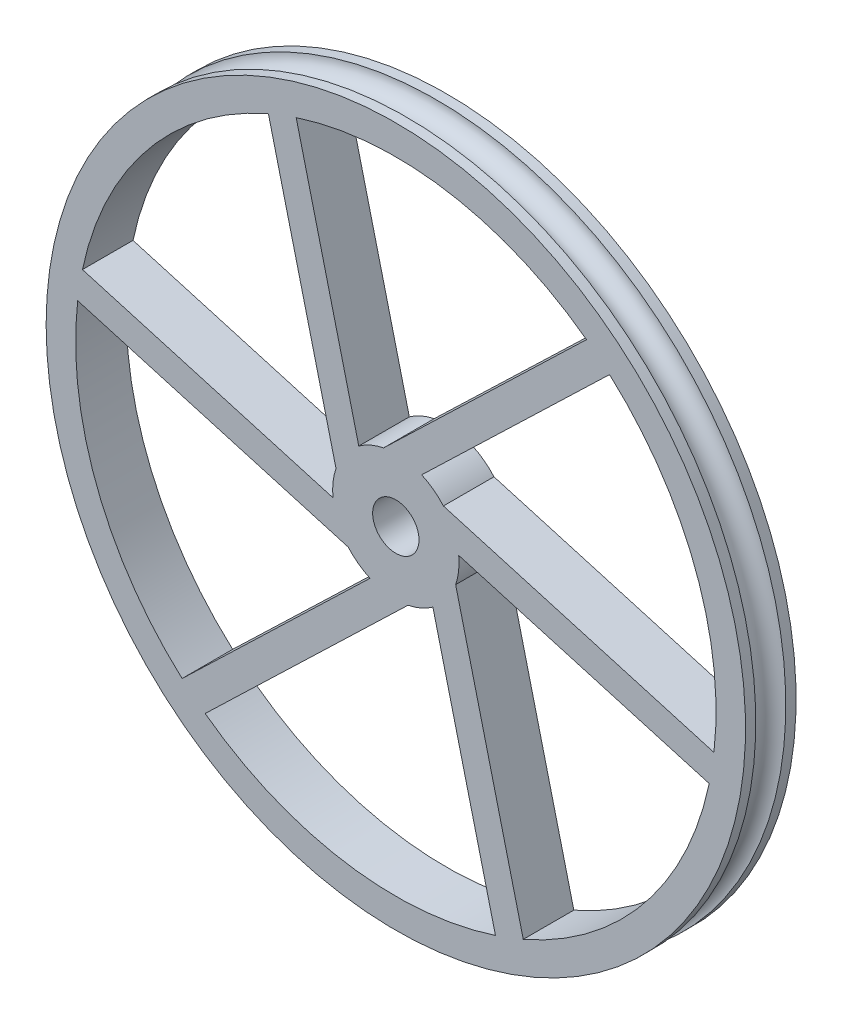
ISO-10303-21;
HEADER;
FILE_DESCRIPTION(('STEP AP214'),'2;1');
FILE_NAME('part.step','',(''),(''),'','','');
FILE_SCHEMA(('AUTOMOTIVE_DESIGN { 1 0 10303 214 1 1 1 1 }'));
ENDSEC;
DATA;
#1=APPLICATION_CONTEXT('core data for automotive mechanical design processes');
#2=APPLICATION_PROTOCOL_DEFINITION('international standard','automotive_design',2000,#1);
#3=PRODUCT_CONTEXT('',#1,'mechanical');
#4=PRODUCT('Part','Part','',(#3));
#5=PRODUCT_RELATED_PRODUCT_CATEGORY('part','',(#4));
#6=PRODUCT_DEFINITION_FORMATION('','',#4);
#7=PRODUCT_DEFINITION_CONTEXT('part definition',#1,'design');
#8=PRODUCT_DEFINITION('design','',#6,#7);
#9=PRODUCT_DEFINITION_SHAPE('','',#8);
#10=(LENGTH_UNIT() NAMED_UNIT(*) SI_UNIT(.MILLI.,.METRE.));
#11=(NAMED_UNIT(*) PLANE_ANGLE_UNIT() SI_UNIT($,.RADIAN.));
#12=(NAMED_UNIT(*) SI_UNIT($,.STERADIAN.) SOLID_ANGLE_UNIT());
#13=UNCERTAINTY_MEASURE_WITH_UNIT(LENGTH_MEASURE(1.E-05),#10,'distance_accuracy_value','');
#14=(GEOMETRIC_REPRESENTATION_CONTEXT(3) GLOBAL_UNCERTAINTY_ASSIGNED_CONTEXT((#13)) GLOBAL_UNIT_ASSIGNED_CONTEXT((#10,
#11,#12)) REPRESENTATION_CONTEXT('',''));
#15=CARTESIAN_POINT('',(0.,0.,0.));
#16=DIRECTION('',(0.,0.,1.));
#17=DIRECTION('',(1.,0.,0.));
#18=AXIS2_PLACEMENT_3D('',#15,#16,#17);
#19=CARTESIAN_POINT('',(0.,0.,-19.9253514058086));
#20=DIRECTION('',(0.,0.,-1.));
#21=DIRECTION('',(-1.,0.,0.));
#22=AXIS2_PLACEMENT_3D('',#19,#20,#21);
#23=CYLINDRICAL_SURFACE('',#22,38.);
#24=CARTESIAN_POINT('',(0.,0.,-3.));
#25=DIRECTION('',(0.,0.,-1.));
#26=DIRECTION('',(-1.,0.,0.));
#27=AXIS2_PLACEMENT_3D('',#24,#25,#26);
#28=CIRCLE('',#27,38.);
#29=CARTESIAN_POINT('',(-37.1875077373794,7.81596240282339,-3.));
#30=VERTEX_POINT('',#29);
#31=CARTESIAN_POINT('',(-15.1209287709684,34.8619780434688,-3.));
#32=VERTEX_POINT('',#31);
#33=EDGE_CURVE('E425',#30,#32,#28,.T.);
#34=ORIENTED_EDGE('',*,*,#33,.T.);
#35=DIRECTION('',(0.,0.,-1.));
#36=VECTOR('',#35,1.);
#37=CARTESIAN_POINT('',(-15.1209287709684,34.8619780434688,-19.9253514058086));
#38=LINE('',#37,#36);
#39=CARTESIAN_POINT('',(-15.1209287709684,34.8619780434688,3.));
#40=VERTEX_POINT('',#39);
#41=EDGE_CURVE('E58',#32,#40,#38,.F.);
#42=ORIENTED_EDGE('',*,*,#41,.T.);
#43=CARTESIAN_POINT('',(0.,0.,3.));
#44=DIRECTION('',(0.,0.,-1.));
#45=DIRECTION('',(-1.,0.,0.));
#46=AXIS2_PLACEMENT_3D('',#43,#44,#45);
#47=CIRCLE('',#46,38.);
#48=CARTESIAN_POINT('',(-37.1875077373794,7.81596240282339,3.));
#49=VERTEX_POINT('',#48);
#50=EDGE_CURVE('E387',#49,#40,#47,.T.);
#51=ORIENTED_EDGE('',*,*,#50,.F.);
#52=DIRECTION('',(0.,0.,-1.));
#53=VECTOR('',#52,1.);
#54=CARTESIAN_POINT('',(-37.1875077373794,7.81596240282339,-19.9253514058086));
#55=LINE('',#54,#53);
#56=EDGE_CURVE('E287',#49,#30,#55,.T.);
#57=ORIENTED_EDGE('',*,*,#56,.T.);
#58=EDGE_LOOP('',(#34,#42,#51,#57));
#59=FACE_BOUND('',#58,.T.);
#60=ADVANCED_FACE('F35',(#59),#23,.F.);
#61=CARTESIAN_POINT('',(0.,0.,24.2132034355964));
#62=DIRECTION('',(0.,0.,-1.));
#63=DIRECTION('',(-1.,0.,0.));
#64=AXIS2_PLACEMENT_3D('',#61,#62,#63);
#65=CYLINDRICAL_SURFACE('',#64,7.5);
#66=CARTESIAN_POINT('',(0.,0.,3.));
#67=DIRECTION('',(0.,0.,-1.));
#68=DIRECTION('',(-1.,0.,0.));
#69=AXIS2_PLACEMENT_3D('',#66,#67,#68);
#70=CIRCLE('',#69,7.5);
#71=CARTESIAN_POINT('',(-7.46029961760869,-0.770668291489712,3.));
#72=VERTEX_POINT('',#71);
#73=CARTESIAN_POINT('',(-7.09899238602963,2.41956754464373,3.));
#74=VERTEX_POINT('',#73);
#75=EDGE_CURVE('E222',#72,#74,#70,.T.);
#76=ORIENTED_EDGE('',*,*,#75,.T.);
#77=DIRECTION('',(0.,0.,1.));
#78=VECTOR('',#77,1.);
#79=CARTESIAN_POINT('',(-7.09899238602963,2.41956754464373,-39.1272046270146));
#80=LINE('',#79,#78);
#81=CARTESIAN_POINT('',(-7.09899238602963,2.41956754464373,-3.));
#82=VERTEX_POINT('',#81);
#83=EDGE_CURVE('E215',#82,#74,#80,.T.);
#84=ORIENTED_EDGE('',*,*,#83,.F.);
#85=CARTESIAN_POINT('',(0.,0.,-3.));
#86=DIRECTION('',(0.,0.,1.));
#87=DIRECTION('',(1.,0.,0.));
#88=AXIS2_PLACEMENT_3D('',#85,#86,#87);
#89=CIRCLE('',#88,7.5);
#90=CARTESIAN_POINT('',(-7.46029961760869,-0.770668291489713,-3.));
#91=VERTEX_POINT('',#90);
#92=EDGE_CURVE('E353',#91,#82,#89,.F.);
#93=ORIENTED_EDGE('',*,*,#92,.F.);
#94=DIRECTION('',(0.,0.,1.));
#95=VECTOR('',#94,1.);
#96=CARTESIAN_POINT('',(-7.46029961760869,-0.770668291489712,-39.1272046270146));
#97=LINE('',#96,#95);
#98=EDGE_CURVE('E272',#91,#72,#97,.T.);
#99=ORIENTED_EDGE('',*,*,#98,.T.);
#100=EDGE_LOOP('',(#76,#84,#93,#99));
#101=FACE_BOUND('',#100,.T.);
#102=ADVANCED_FACE('F452',(#101),#65,.T.);
#103=CARTESIAN_POINT('',(-25.3625758645587,-28.2973452025893,-3.));
#104=VERTEX_POINT('',#103);
#105=CARTESIAN_POINT('',(-37.7518229973035,4.33588057726065,-3.));
#106=VERTEX_POINT('',#105);
#107=EDGE_CURVE('E426',#104,#106,#28,.T.);
#108=ORIENTED_EDGE('',*,*,#107,.T.);
#109=DIRECTION('',(0.,0.,-1.));
#110=VECTOR('',#109,1.);
#111=CARTESIAN_POINT('',(-37.7518229973035,4.33588057726065,-19.9253514058086));
#112=LINE('',#111,#110);
#113=CARTESIAN_POINT('',(-37.7518229973035,4.33588057726065,3.));
#114=VERTEX_POINT('',#113);
#115=EDGE_CURVE('E290',#106,#114,#112,.F.);
#116=ORIENTED_EDGE('',*,*,#115,.T.);
#117=CARTESIAN_POINT('',(-25.3625758645587,-28.2973452025893,3.));
#118=VERTEX_POINT('',#117);
#119=EDGE_CURVE('E269',#118,#114,#47,.T.);
#120=ORIENTED_EDGE('',*,*,#119,.F.);
#121=DIRECTION('',(0.,0.,-1.));
#122=VECTOR('',#121,1.);
#123=CARTESIAN_POINT('',(-25.3625758645587,-28.2973452025893,-19.9253514058086));
#124=LINE('',#123,#122);
#125=EDGE_CURVE('E305',#118,#104,#124,.T.);
#126=ORIENTED_EDGE('',*,*,#125,.T.);
#127=EDGE_LOOP('',(#108,#116,#120,#126));
#128=FACE_BOUND('',#127,.T.);
#129=ADVANCED_FACE('F453',(#128),#23,.F.);
#130=CARTESIAN_POINT('',(-3.06273149048309,-6.84614313443728,3.));
#131=VERTEX_POINT('',#130);
#132=CARTESIAN_POINT('',(-5.64490315284863,-4.9381239752521,3.));
#133=VERTEX_POINT('',#132);
#134=EDGE_CURVE('E227',#131,#133,#70,.T.);
#135=ORIENTED_EDGE('',*,*,#134,.T.);
#136=DIRECTION('',(0.,0.,1.));
#137=VECTOR('',#136,1.);
#138=CARTESIAN_POINT('',(-5.64490315284863,-4.9381239752521,-39.1272046270146));
#139=LINE('',#138,#137);
#140=CARTESIAN_POINT('',(-5.64490315284863,-4.9381239752521,-3.));
#141=VERTEX_POINT('',#140);
#142=EDGE_CURVE('E259',#141,#133,#139,.T.);
#143=ORIENTED_EDGE('',*,*,#142,.F.);
#144=CARTESIAN_POINT('',(-3.06273149048312,-6.84614313443731,-3.));
#145=VERTEX_POINT('',#144);
#146=EDGE_CURVE('E357',#145,#141,#89,.F.);
#147=ORIENTED_EDGE('',*,*,#146,.F.);
#148=DIRECTION('',(0.,0.,1.));
#149=VECTOR('',#148,1.);
#150=CARTESIAN_POINT('',(-3.06273149048309,-6.84614313443728,-39.1272046270146));
#151=LINE('',#150,#149);
#152=EDGE_CURVE('E261',#145,#131,#151,.T.);
#153=ORIENTED_EDGE('',*,*,#152,.T.);
#154=EDGE_LOOP('',(#135,#143,#147,#153));
#155=FACE_BOUND('',#154,.T.);
#156=ADVANCED_FACE('F256',(#155),#65,.T.);
#157=CARTESIAN_POINT('',(11.8249318728208,-36.1133076054125,-3.));
#158=VERTEX_POINT('',#157);
#159=CARTESIAN_POINT('',(-22.6308942263349,-30.5260974662082,-3.));
#160=VERTEX_POINT('',#159);
#161=EDGE_CURVE('E427',#158,#160,#28,.T.);
#162=ORIENTED_EDGE('',*,*,#161,.T.);
#163=DIRECTION('',(0.,0.,-1.));
#164=VECTOR('',#163,1.);
#165=CARTESIAN_POINT('',(-22.6308942263349,-30.5260974662082,-19.9253514058086));
#166=LINE('',#165,#164);
#167=CARTESIAN_POINT('',(-22.6308942263349,-30.5260974662082,3.));
#168=VERTEX_POINT('',#167);
#169=EDGE_CURVE('E308',#160,#168,#166,.F.);
#170=ORIENTED_EDGE('',*,*,#169,.T.);
#171=CARTESIAN_POINT('',(11.8249318728208,-36.1133076054125,3.));
#172=VERTEX_POINT('',#171);
#173=EDGE_CURVE('E384',#172,#168,#47,.T.);
#174=ORIENTED_EDGE('',*,*,#173,.F.);
#175=DIRECTION('',(0.,0.,-1.));
#176=VECTOR('',#175,1.);
#177=CARTESIAN_POINT('',(11.8249318728208,-36.1133076054125,-19.9253514058086));
#178=LINE('',#177,#176);
#179=EDGE_CURVE('E326',#172,#158,#178,.T.);
#180=ORIENTED_EDGE('',*,*,#179,.T.);
#181=EDGE_LOOP('',(#162,#170,#174,#180));
#182=FACE_BOUND('',#181,.T.);
#183=ADVANCED_FACE('F431',(#182),#23,.F.);
#184=CARTESIAN_POINT('',(4.39756812712559,-6.07547484294757,3.));
#185=VERTEX_POINT('',#184);
#186=CARTESIAN_POINT('',(1.45408923318101,-7.3576915198958,3.));
#187=VERTEX_POINT('',#186);
#188=EDGE_CURVE('E241',#185,#187,#70,.T.);
#189=ORIENTED_EDGE('',*,*,#188,.T.);
#190=DIRECTION('',(0.,0.,1.));
#191=VECTOR('',#190,1.);
#192=CARTESIAN_POINT('',(1.45408923318101,-7.3576915198958,-39.1272046270146));
#193=LINE('',#192,#191);
#194=CARTESIAN_POINT('',(1.45408923318101,-7.3576915198958,-3.));
#195=VERTEX_POINT('',#194);
#196=EDGE_CURVE('E296',#195,#187,#193,.T.);
#197=ORIENTED_EDGE('',*,*,#196,.F.);
#198=CARTESIAN_POINT('',(4.3975681271256,-6.07547484294759,-3.));
#199=VERTEX_POINT('',#198);
#200=EDGE_CURVE('E361',#199,#195,#89,.F.);
#201=ORIENTED_EDGE('',*,*,#200,.F.);
#202=DIRECTION('',(0.,0.,1.));
#203=VECTOR('',#202,1.);
#204=CARTESIAN_POINT('',(4.39756812712559,-6.07547484294757,-39.1272046270146));
#205=LINE('',#204,#203);
#206=EDGE_CURVE('E320',#199,#185,#205,.T.);
#207=ORIENTED_EDGE('',*,*,#206,.T.);
#208=EDGE_LOOP('',(#189,#197,#201,#207));
#209=FACE_BOUND('',#208,.T.);
#210=ADVANCED_FACE('F473',(#209),#65,.T.);
#211=CARTESIAN_POINT('',(37.1875077373794,-7.81596240282326,-3.));
#212=VERTEX_POINT('',#211);
#213=CARTESIAN_POINT('',(15.1209287709687,-34.8619780434686,-3.));
#214=VERTEX_POINT('',#213);
#215=EDGE_CURVE('E381',#212,#214,#28,.T.);
#216=ORIENTED_EDGE('',*,*,#215,.T.);
#217=DIRECTION('',(0.,0.,-1.));
#218=VECTOR('',#217,1.);
#219=CARTESIAN_POINT('',(15.1209287709687,-34.8619780434686,-19.9253514058086));
#220=LINE('',#219,#218);
#221=CARTESIAN_POINT('',(15.1209287709687,-34.8619780434686,3.));
#222=VERTEX_POINT('',#221);
#223=EDGE_CURVE('E329',#214,#222,#220,.F.);
#224=ORIENTED_EDGE('',*,*,#223,.T.);
#225=CARTESIAN_POINT('',(37.1875077373794,-7.81596240282326,3.));
#226=VERTEX_POINT('',#225);
#227=EDGE_CURVE('E43',#226,#222,#47,.T.);
#228=ORIENTED_EDGE('',*,*,#227,.F.);
#229=DIRECTION('',(0.,0.,-1.));
#230=VECTOR('',#229,1.);
#231=CARTESIAN_POINT('',(37.1875077373794,-7.81596240282326,-19.9253514058086));
#232=LINE('',#231,#230);
#233=EDGE_CURVE('E347',#226,#212,#232,.T.);
#234=ORIENTED_EDGE('',*,*,#233,.T.);
#235=EDGE_LOOP('',(#216,#224,#228,#234));
#236=FACE_BOUND('',#235,.T.);
#237=ADVANCED_FACE('F379',(#236),#23,.F.);
#238=CARTESIAN_POINT('',(7.4602996176087,0.770668291489744,3.));
#239=VERTEX_POINT('',#238);
#240=CARTESIAN_POINT('',(7.09899238602964,-2.4195675446437,3.));
#241=VERTEX_POINT('',#240);
#242=EDGE_CURVE('E234',#239,#241,#70,.T.);
#243=ORIENTED_EDGE('',*,*,#242,.T.);
#244=DIRECTION('',(0.,0.,1.));
#245=VECTOR('',#244,1.);
#246=CARTESIAN_POINT('',(7.09899238602964,-2.4195675446437,-39.1272046270146));
#247=LINE('',#246,#245);
#248=CARTESIAN_POINT('',(7.09899238602964,-2.4195675446437,-3.));
#249=VERTEX_POINT('',#248);
#250=EDGE_CURVE('E315',#249,#241,#247,.T.);
#251=ORIENTED_EDGE('',*,*,#250,.F.);
#252=CARTESIAN_POINT('',(7.46029961760868,0.770668291489751,-3.));
#253=VERTEX_POINT('',#252);
#254=EDGE_CURVE('E229',#253,#249,#89,.F.);
#255=ORIENTED_EDGE('',*,*,#254,.F.);
#256=DIRECTION('',(0.,0.,1.));
#257=VECTOR('',#256,1.);
#258=CARTESIAN_POINT('',(7.4602996176087,0.770668291489744,-39.1272046270146));
#259=LINE('',#258,#257);
#260=EDGE_CURVE('E341',#253,#239,#259,.T.);
#261=ORIENTED_EDGE('',*,*,#260,.T.);
#262=EDGE_LOOP('',(#243,#251,#255,#261));
#263=FACE_BOUND('',#262,.T.);
#264=ADVANCED_FACE('F372',(#263),#65,.T.);
#265=CARTESIAN_POINT('',(25.3625758645589,28.2973452025892,-3.));
#266=VERTEX_POINT('',#265);
#267=CARTESIAN_POINT('',(37.7518229973035,-4.33588057726052,-3.));
#268=VERTEX_POINT('',#267);
#269=EDGE_CURVE('E405',#266,#268,#28,.T.);
#270=ORIENTED_EDGE('',*,*,#269,.T.);
#271=DIRECTION('',(0.,0.,-1.));
#272=VECTOR('',#271,1.);
#273=CARTESIAN_POINT('',(37.7518229973035,-4.33588057726051,-19.9253514058086));
#274=LINE('',#273,#272);
#275=CARTESIAN_POINT('',(37.7518229973035,-4.33588057726052,3.));
#276=VERTEX_POINT('',#275);
#277=EDGE_CURVE('E350',#268,#276,#274,.F.);
#278=ORIENTED_EDGE('',*,*,#277,.T.);
#279=CARTESIAN_POINT('',(25.3625758645589,28.2973452025892,3.));
#280=VERTEX_POINT('',#279);
#281=EDGE_CURVE('E11',#280,#276,#47,.T.);
#282=ORIENTED_EDGE('',*,*,#281,.F.);
#283=DIRECTION('',(0.,0.,-1.));
#284=VECTOR('',#283,1.);
#285=CARTESIAN_POINT('',(25.3625758645589,28.2973452025892,-19.9253514058086));
#286=LINE('',#285,#284);
#287=EDGE_CURVE('E410',#280,#266,#286,.T.);
#288=ORIENTED_EDGE('',*,*,#287,.T.);
#289=EDGE_LOOP('',(#270,#278,#282,#288));
#290=FACE_BOUND('',#289,.T.);
#291=ADVANCED_FACE('F462',(#290),#23,.F.);
#292=CARTESIAN_POINT('',(3.0627314904831,6.84614313443731,3.));
#293=VERTEX_POINT('',#292);
#294=CARTESIAN_POINT('',(5.64490315284864,4.93812397525213,3.));
#295=VERTEX_POINT('',#294);
#296=EDGE_CURVE('E225',#293,#295,#70,.T.);
#297=ORIENTED_EDGE('',*,*,#296,.T.);
#298=DIRECTION('',(0.,0.,1.));
#299=VECTOR('',#298,1.);
#300=CARTESIAN_POINT('',(5.64490315284864,4.93812397525213,-39.1272046270146));
#301=LINE('',#300,#299);
#302=CARTESIAN_POINT('',(5.64490315284864,4.93812397525213,-3.));
#303=VERTEX_POINT('',#302);
#304=EDGE_CURVE('E336',#303,#295,#301,.T.);
#305=ORIENTED_EDGE('',*,*,#304,.F.);
#306=CARTESIAN_POINT('',(3.0627314904831,6.84614313443731,-3.));
#307=VERTEX_POINT('',#306);
#308=EDGE_CURVE('E223',#307,#303,#89,.F.);
#309=ORIENTED_EDGE('',*,*,#308,.F.);
#310=DIRECTION('',(0.,0.,1.));
#311=VECTOR('',#310,1.);
#312=CARTESIAN_POINT('',(3.06273149048311,6.84614313443731,-39.1272046270146));
#313=LINE('',#312,#311);
#314=EDGE_CURVE('E417',#307,#293,#313,.T.);
#315=ORIENTED_EDGE('',*,*,#314,.T.);
#316=EDGE_LOOP('',(#297,#305,#309,#315));
#317=FACE_BOUND('',#316,.T.);
#318=ADVANCED_FACE('F461',(#317),#65,.T.);
#319=CARTESIAN_POINT('',(-11.8249318728205,36.1133076054127,3.));
#320=VERTEX_POINT('',#319);
#321=CARTESIAN_POINT('',(22.6308942263351,30.5260974662081,3.));
#322=VERTEX_POINT('',#321);
#323=EDGE_CURVE('E44',#320,#322,#47,.T.);
#324=ORIENTED_EDGE('',*,*,#323,.F.);
#325=DIRECTION('',(0.,0.,-1.));
#326=VECTOR('',#325,1.);
#327=CARTESIAN_POINT('',(-11.8249318728205,36.1133076054127,-19.9253514058086));
#328=LINE('',#327,#326);
#329=CARTESIAN_POINT('',(-11.8249318728205,36.1133076054127,-3.));
#330=VERTEX_POINT('',#329);
#331=EDGE_CURVE('E202',#320,#330,#328,.T.);
#332=ORIENTED_EDGE('',*,*,#331,.T.);
#333=CARTESIAN_POINT('',(22.6308942263351,30.5260974662081,-3.));
#334=VERTEX_POINT('',#333);
#335=EDGE_CURVE('E407',#330,#334,#28,.T.);
#336=ORIENTED_EDGE('',*,*,#335,.T.);
#337=DIRECTION('',(0.,0.,-1.));
#338=VECTOR('',#337,1.);
#339=CARTESIAN_POINT('',(22.6308942263351,30.5260974662081,-19.9253514058086));
#340=LINE('',#339,#338);
#341=EDGE_CURVE('E408',#334,#322,#340,.F.);
#342=ORIENTED_EDGE('',*,*,#341,.T.);
#343=EDGE_LOOP('',(#324,#332,#336,#342));
#344=FACE_BOUND('',#343,.T.);
#345=ADVANCED_FACE('F37',(#344),#23,.F.);
#346=CARTESIAN_POINT('',(38.,0.,3.));
#347=DIRECTION('',(0.,0.,-1.));
#348=DIRECTION('',(-1.,0.,0.));
#349=AXIS2_PLACEMENT_3D('',#346,#347,#348);
#350=PLANE('',#349);
#351=CARTESIAN_POINT('',(0.,0.,3.));
#352=DIRECTION('',(0.,0.,1.));
#353=DIRECTION('',(1.,0.,0.));
#354=AXIS2_PLACEMENT_3D('',#351,#352,#353);
#355=CIRCLE('',#354,2.75);
#356=CARTESIAN_POINT('',(2.75,0.,3.));
#357=VERTEX_POINT('',#356);
#358=EDGE_CURVE('E714',#357,#357,#355,.T.);
#359=ORIENTED_EDGE('',*,*,#358,.F.);
#360=EDGE_LOOP('',(#359));
#361=FACE_BOUND('',#360,.T.);
#362=ORIENTED_EDGE('',*,*,#50,.T.);
#363=DIRECTION('',(0.240037757482638,-0.970763552561954,0.));
#364=VECTOR('',#363,1.);
#365=CARTESIAN_POINT('',(-7.09899238602963,2.41956754464373,3.));
#366=LINE('',#365,#364);
#367=EDGE_CURVE('E205',#40,#74,#366,.T.);
#368=ORIENTED_EDGE('',*,*,#367,.T.);
#369=ORIENTED_EDGE('',*,*,#75,.F.);
#370=DIRECTION('',(-0.960724776328003,0.277502980433561,0.));
#371=VECTOR('',#370,1.);
#372=CARTESIAN_POINT('',(-37.3382851164829,7.85951407663689,3.));
#373=LINE('',#372,#371);
#374=EDGE_CURVE('E273',#72,#49,#373,.T.);
#375=ORIENTED_EDGE('',*,*,#374,.T.);
#376=EDGE_LOOP('',(#362,#368,#369,#375));
#377=FACE_BOUND('',#376,.T.);
#378=ORIENTED_EDGE('',*,*,#119,.T.);
#379=DIRECTION('',(0.960724776328002,-0.277502980433561,0.));
#380=VECTOR('',#379,1.);
#381=CARTESIAN_POINT('',(-5.64490315284863,-4.9381239752521,3.));
#382=LINE('',#381,#380);
#383=EDGE_CURVE('E268',#114,#133,#382,.T.);
#384=ORIENTED_EDGE('',*,*,#383,.T.);
#385=ORIENTED_EDGE('',*,*,#134,.F.);
#386=DIRECTION('',(-0.720687018845356,-0.693260572128397,0.));
#387=VECTOR('',#386,1.);
#388=CARTESIAN_POINT('',(-25.4756814100103,-28.4061464063023,3.));
#389=LINE('',#388,#387);
#390=EDGE_CURVE('E266',#131,#118,#389,.T.);
#391=ORIENTED_EDGE('',*,*,#390,.T.);
#392=EDGE_LOOP('',(#378,#384,#385,#391));
#393=FACE_BOUND('',#392,.T.);
#394=ORIENTED_EDGE('',*,*,#173,.T.);
#395=DIRECTION('',(0.720687018845357,0.693260572128397,0.));
#396=VECTOR('',#395,1.);
#397=CARTESIAN_POINT('',(1.45408923318101,-7.3576915198958,3.));
#398=LINE('',#397,#396);
#399=EDGE_CURVE('E298',#168,#187,#398,.T.);
#400=ORIENTED_EDGE('',*,*,#399,.T.);
#401=ORIENTED_EDGE('',*,*,#188,.F.);
#402=DIRECTION('',(0.240037757482649,-0.970763552561951,0.));
#403=VECTOR('',#402,1.);
#404=CARTESIAN_POINT('',(11.8626037064728,-36.2656604829392,3.));
#405=LINE('',#404,#403);
#406=EDGE_CURVE('E310',#185,#172,#405,.T.);
#407=ORIENTED_EDGE('',*,*,#406,.T.);
#408=EDGE_LOOP('',(#394,#400,#401,#407));
#409=FACE_BOUND('',#408,.T.);
#410=ORIENTED_EDGE('',*,*,#227,.T.);
#411=DIRECTION('',(-0.240037757482648,0.970763552561952,0.));
#412=VECTOR('',#411,1.);
#413=CARTESIAN_POINT('',(7.09899238602964,-2.4195675446437,3.));
#414=LINE('',#413,#412);
#415=EDGE_CURVE('E318',#222,#241,#414,.T.);
#416=ORIENTED_EDGE('',*,*,#415,.T.);
#417=ORIENTED_EDGE('',*,*,#242,.F.);
#418=DIRECTION('',(0.960724776328003,-0.277502980433558,0.));
#419=VECTOR('',#418,1.);
#420=CARTESIAN_POINT('',(37.3382851164833,-7.85951407663688,3.));
#421=LINE('',#420,#419);
#422=EDGE_CURVE('E331',#239,#226,#421,.T.);
#423=ORIENTED_EDGE('',*,*,#422,.T.);
#424=EDGE_LOOP('',(#410,#416,#417,#423));
#425=FACE_BOUND('',#424,.T.);
#426=ORIENTED_EDGE('',*,*,#281,.T.);
#427=DIRECTION('',(-0.960724776328003,0.277502980433559,0.));
#428=VECTOR('',#427,1.);
#429=CARTESIAN_POINT('',(5.64490315284864,4.93812397525213,3.));
#430=LINE('',#429,#428);
#431=EDGE_CURVE('E339',#276,#295,#430,.T.);
#432=ORIENTED_EDGE('',*,*,#431,.T.);
#433=ORIENTED_EDGE('',*,*,#296,.F.);
#434=DIRECTION('',(0.720687018845363,0.693260572128391,0.));
#435=VECTOR('',#434,1.);
#436=CARTESIAN_POINT('',(25.4756814100107,28.4061464063023,3.));
#437=LINE('',#436,#435);
#438=EDGE_CURVE('E233',#293,#280,#437,.T.);
#439=ORIENTED_EDGE('',*,*,#438,.T.);
#440=EDGE_LOOP('',(#426,#432,#433,#439));
#441=FACE_BOUND('',#440,.T.);
#442=CARTESIAN_POINT('',(-4.39756812712559,6.0754748429476,3.));
#443=VERTEX_POINT('',#442);
#444=CARTESIAN_POINT('',(-1.454089233181,7.35769151989584,3.));
#445=VERTEX_POINT('',#444);
#446=EDGE_CURVE('E212',#443,#445,#70,.T.);
#447=ORIENTED_EDGE('',*,*,#446,.F.);
#448=DIRECTION('',(-0.240037757482638,0.970763552561954,0.));
#449=VECTOR('',#448,1.);
#450=CARTESIAN_POINT('',(-11.8626037064724,36.2656604829392,3.));
#451=LINE('',#450,#449);
#452=EDGE_CURVE('E196',#443,#320,#451,.T.);
#453=ORIENTED_EDGE('',*,*,#452,.T.);
#454=ORIENTED_EDGE('',*,*,#323,.T.);
#455=DIRECTION('',(-0.720687018845363,-0.693260572128391,0.));
#456=VECTOR('',#455,1.);
#457=CARTESIAN_POINT('',(-1.454089233181,7.35769151989584,3.));
#458=LINE('',#457,#456);
#459=EDGE_CURVE('E220',#322,#445,#458,.T.);
#460=ORIENTED_EDGE('',*,*,#459,.T.);
#461=EDGE_LOOP('',(#447,#453,#454,#460));
#462=FACE_BOUND('',#461,.T.);
#463=CARTESIAN_POINT('',(0.,0.,3.));
#464=DIRECTION('',(0.,0.,-1.));
#465=DIRECTION('',(-1.,0.,0.));
#466=AXIS2_PLACEMENT_3D('',#463,#464,#465);
#467=CIRCLE('',#466,41.5);
#468=CARTESIAN_POINT('',(-41.5,0.,3.));
#469=VERTEX_POINT('',#468);
#470=EDGE_CURVE('E391',#469,#469,#467,.T.);
#471=ORIENTED_EDGE('',*,*,#470,.F.);
#472=EDGE_LOOP('',(#471));
#473=FACE_BOUND('',#472,.T.);
#474=ADVANCED_FACE('F217',(#361,#377,#393,#409,#425,#441,#462,#473),#350,.F.);
#475=CARTESIAN_POINT('',(0.,0.,-19.9253514058086));
#476=DIRECTION('',(0.,0.,-1.));
#477=DIRECTION('',(-1.,0.,0.));
#478=AXIS2_PLACEMENT_3D('',#475,#476,#477);
#479=CYLINDRICAL_SURFACE('',#478,41.5);
#480=CARTESIAN_POINT('',(0.,0.,1.78));
#481=DIRECTION('',(0.,0.,-1.));
#482=DIRECTION('',(-1.,0.,0.));
#483=AXIS2_PLACEMENT_3D('',#480,#481,#482);
#484=CIRCLE('',#483,41.5);
#485=CARTESIAN_POINT('',(-41.5,0.,1.78));
#486=VERTEX_POINT('',#485);
#487=EDGE_CURVE('E393',#486,#486,#484,.T.);
#488=ORIENTED_EDGE('',*,*,#487,.F.);
#489=EDGE_LOOP('',(#488));
#490=FACE_BOUND('',#489,.T.);
#491=ORIENTED_EDGE('',*,*,#470,.T.);
#492=EDGE_LOOP('',(#491));
#493=FACE_BOUND('',#492,.T.);
#494=ADVANCED_FACE('F467',(#490,#493),#479,.T.);
#495=CARTESIAN_POINT('',(0.,0.,0.));
#496=DIRECTION('',(0.,0.,-1.));
#497=DIRECTION('',(-1.,0.,0.));
#498=AXIS2_PLACEMENT_3D('',#495,#496,#497);
#499=TOROIDAL_SURFACE('',#498,41.5,1.78);
#500=CARTESIAN_POINT('',(0.,0.,-1.78));
#501=DIRECTION('',(0.,0.,-1.));
#502=DIRECTION('',(-1.,0.,0.));
#503=AXIS2_PLACEMENT_3D('',#500,#501,#502);
#504=CIRCLE('',#503,41.5);
#505=CARTESIAN_POINT('',(-41.5,0.,-1.78));
#506=VERTEX_POINT('',#505);
#507=EDGE_CURVE('E397',#506,#506,#504,.T.);
#508=ORIENTED_EDGE('',*,*,#507,.F.);
#509=EDGE_LOOP('',(#508));
#510=FACE_BOUND('',#509,.T.);
#511=ORIENTED_EDGE('',*,*,#487,.T.);
#512=EDGE_LOOP('',(#511));
#513=FACE_BOUND('',#512,.T.);
#514=ADVANCED_FACE('F446',(#510,#513),#499,.F.);
#515=CARTESIAN_POINT('',(0.,0.,-19.9253514058086));
#516=DIRECTION('',(0.,0.,-1.));
#517=DIRECTION('',(-1.,0.,0.));
#518=AXIS2_PLACEMENT_3D('',#515,#516,#517);
#519=CYLINDRICAL_SURFACE('',#518,41.5);
#520=CARTESIAN_POINT('',(0.,0.,-3.));
#521=DIRECTION('',(0.,0.,-1.));
#522=DIRECTION('',(-1.,0.,0.));
#523=AXIS2_PLACEMENT_3D('',#520,#521,#522);
#524=CIRCLE('',#523,41.5);
#525=CARTESIAN_POINT('',(-41.5,0.,-3.));
#526=VERTEX_POINT('',#525);
#527=EDGE_CURVE('E402',#526,#526,#524,.T.);
#528=ORIENTED_EDGE('',*,*,#527,.F.);
#529=EDGE_LOOP('',(#528));
#530=FACE_BOUND('',#529,.T.);
#531=ORIENTED_EDGE('',*,*,#507,.T.);
#532=EDGE_LOOP('',(#531));
#533=FACE_BOUND('',#532,.T.);
#534=ADVANCED_FACE('F437',(#530,#533),#519,.T.);
#535=CARTESIAN_POINT('',(38.,0.,-3.));
#536=DIRECTION('',(0.,0.,1.));
#537=DIRECTION('',(1.,0.,0.));
#538=AXIS2_PLACEMENT_3D('',#535,#536,#537);
#539=PLANE('',#538);
#540=CARTESIAN_POINT('',(0.,0.,-3.));
#541=DIRECTION('',(0.,0.,1.));
#542=DIRECTION('',(1.,0.,0.));
#543=AXIS2_PLACEMENT_3D('',#540,#541,#542);
#544=CIRCLE('',#543,2.75);
#545=CARTESIAN_POINT('',(2.75,0.,-3.));
#546=VERTEX_POINT('',#545);
#547=EDGE_CURVE('E206',#546,#546,#544,.F.);
#548=ORIENTED_EDGE('',*,*,#547,.F.);
#549=EDGE_LOOP('',(#548));
#550=FACE_BOUND('',#549,.T.);
#551=ORIENTED_EDGE('',*,*,#335,.F.);
#552=DIRECTION('',(0.240037757482638,-0.970763552561955,0.));
#553=VECTOR('',#552,1.);
#554=CARTESIAN_POINT('',(-11.8626037064724,36.2656604829392,-3.));
#555=LINE('',#554,#553);
#556=CARTESIAN_POINT('',(-4.39756812712559,6.0754748429476,-3.));
#557=VERTEX_POINT('',#556);
#558=EDGE_CURVE('E719',#330,#557,#555,.T.);
#559=ORIENTED_EDGE('',*,*,#558,.T.);
#560=CARTESIAN_POINT('',(-1.454089233181,7.35769151989584,-3.));
#561=VERTEX_POINT('',#560);
#562=EDGE_CURVE('E214',#557,#561,#89,.F.);
#563=ORIENTED_EDGE('',*,*,#562,.T.);
#564=DIRECTION('',(0.720687018845363,0.693260572128391,0.));
#565=VECTOR('',#564,1.);
#566=CARTESIAN_POINT('',(-1.454089233181,7.35769151989584,-3.));
#567=LINE('',#566,#565);
#568=EDGE_CURVE('E416',#561,#334,#567,.T.);
#569=ORIENTED_EDGE('',*,*,#568,.T.);
#570=EDGE_LOOP('',(#551,#559,#563,#569));
#571=FACE_BOUND('',#570,.T.);
#572=DIRECTION('',(-0.240037757482638,0.970763552561954,0.));
#573=VECTOR('',#572,1.);
#574=CARTESIAN_POINT('',(-7.09899238602963,2.41956754464373,-3.));
#575=LINE('',#574,#573);
#576=EDGE_CURVE('E718',#82,#32,#575,.T.);
#577=ORIENTED_EDGE('',*,*,#576,.T.);
#578=ORIENTED_EDGE('',*,*,#33,.F.);
#579=DIRECTION('',(0.960724776328003,-0.277502980433561,0.));
#580=VECTOR('',#579,1.);
#581=CARTESIAN_POINT('',(-37.3382851164829,7.85951407663689,-3.));
#582=LINE('',#581,#580);
#583=EDGE_CURVE('E279',#30,#91,#582,.T.);
#584=ORIENTED_EDGE('',*,*,#583,.T.);
#585=ORIENTED_EDGE('',*,*,#92,.T.);
#586=EDGE_LOOP('',(#577,#578,#584,#585));
#587=FACE_BOUND('',#586,.T.);
#588=DIRECTION('',(-0.960724776328003,0.277502980433561,0.));
#589=VECTOR('',#588,1.);
#590=CARTESIAN_POINT('',(-5.64490315284863,-4.9381239752521,-3.));
#591=LINE('',#590,#589);
#592=EDGE_CURVE('E277',#141,#106,#591,.T.);
#593=ORIENTED_EDGE('',*,*,#592,.T.);
#594=ORIENTED_EDGE('',*,*,#107,.F.);
#595=DIRECTION('',(0.720687018845356,0.693260572128397,0.));
#596=VECTOR('',#595,1.);
#597=CARTESIAN_POINT('',(-25.4756814100103,-28.4061464063023,-3.));
#598=LINE('',#597,#596);
#599=EDGE_CURVE('E295',#104,#145,#598,.T.);
#600=ORIENTED_EDGE('',*,*,#599,.T.);
#601=ORIENTED_EDGE('',*,*,#146,.T.);
#602=EDGE_LOOP('',(#593,#594,#600,#601));
#603=FACE_BOUND('',#602,.T.);
#604=DIRECTION('',(-0.720687018845357,-0.693260572128397,0.));
#605=VECTOR('',#604,1.);
#606=CARTESIAN_POINT('',(1.45408923318101,-7.3576915198958,-3.));
#607=LINE('',#606,#605);
#608=EDGE_CURVE('E292',#195,#160,#607,.T.);
#609=ORIENTED_EDGE('',*,*,#608,.T.);
#610=ORIENTED_EDGE('',*,*,#161,.F.);
#611=DIRECTION('',(-0.24003775748265,0.970763552561952,0.));
#612=VECTOR('',#611,1.);
#613=CARTESIAN_POINT('',(11.8626037064728,-36.2656604829392,-3.));
#614=LINE('',#613,#612);
#615=EDGE_CURVE('E314',#158,#199,#614,.T.);
#616=ORIENTED_EDGE('',*,*,#615,.T.);
#617=ORIENTED_EDGE('',*,*,#200,.T.);
#618=EDGE_LOOP('',(#609,#610,#616,#617));
#619=FACE_BOUND('',#618,.T.);
#620=DIRECTION('',(0.240037757482648,-0.970763552561952,0.));
#621=VECTOR('',#620,1.);
#622=CARTESIAN_POINT('',(7.09899238602964,-2.4195675446437,-3.));
#623=LINE('',#622,#621);
#624=EDGE_CURVE('E311',#249,#214,#623,.T.);
#625=ORIENTED_EDGE('',*,*,#624,.T.);
#626=ORIENTED_EDGE('',*,*,#215,.F.);
#627=DIRECTION('',(-0.960724776328004,0.277502980433558,0.));
#628=VECTOR('',#627,1.);
#629=CARTESIAN_POINT('',(37.3382851164833,-7.85951407663688,-3.));
#630=LINE('',#629,#628);
#631=EDGE_CURVE('E335',#212,#253,#630,.T.);
#632=ORIENTED_EDGE('',*,*,#631,.T.);
#633=ORIENTED_EDGE('',*,*,#254,.T.);
#634=EDGE_LOOP('',(#625,#626,#632,#633));
#635=FACE_BOUND('',#634,.T.);
#636=DIRECTION('',(0.960724776328003,-0.277502980433559,0.));
#637=VECTOR('',#636,1.);
#638=CARTESIAN_POINT('',(5.64490315284864,4.93812397525213,-3.));
#639=LINE('',#638,#637);
#640=EDGE_CURVE('E332',#303,#268,#639,.T.);
#641=ORIENTED_EDGE('',*,*,#640,.T.);
#642=ORIENTED_EDGE('',*,*,#269,.F.);
#643=DIRECTION('',(-0.720687018845363,-0.693260572128391,0.));
#644=VECTOR('',#643,1.);
#645=CARTESIAN_POINT('',(25.4756814100107,28.4061464063023,-3.));
#646=LINE('',#645,#644);
#647=EDGE_CURVE('E413',#266,#307,#646,.T.);
#648=ORIENTED_EDGE('',*,*,#647,.T.);
#649=ORIENTED_EDGE('',*,*,#308,.T.);
#650=EDGE_LOOP('',(#641,#642,#648,#649));
#651=FACE_BOUND('',#650,.T.);
#652=ORIENTED_EDGE('',*,*,#527,.T.);
#653=EDGE_LOOP('',(#652));
#654=FACE_BOUND('',#653,.T.);
#655=ADVANCED_FACE('F369',(#550,#571,#587,#603,#619,#635,#651,#654),#539,.F.);
#656=CARTESIAN_POINT('',(-1.454089233181,7.35769151989584,-39.1272046270146));
#657=DIRECTION('',(-0.693260572128391,0.720687018845363,0.));
#658=DIRECTION('',(-0.720687018845363,-0.693260572128391,0.));
#659=AXIS2_PLACEMENT_3D('',#656,#657,#658);
#660=PLANE('',#659);
#661=ORIENTED_EDGE('',*,*,#341,.F.);
#662=ORIENTED_EDGE('',*,*,#568,.F.);
#663=DIRECTION('',(0.,0.,1.));
#664=VECTOR('',#663,1.);
#665=CARTESIAN_POINT('',(-1.454089233181,7.35769151989584,-39.1272046270146));
#666=LINE('',#665,#664);
#667=EDGE_CURVE('E419',#561,#445,#666,.T.);
#668=ORIENTED_EDGE('',*,*,#667,.T.);
#669=ORIENTED_EDGE('',*,*,#459,.F.);
#670=EDGE_LOOP('',(#661,#662,#668,#669));
#671=FACE_BOUND('',#670,.T.);
#672=ADVANCED_FACE('F424',(#671),#660,.T.);
#673=CARTESIAN_POINT('',(25.4756814100107,28.4061464063023,-39.1272046270146));
#674=DIRECTION('',(0.693260572128391,-0.720687018845363,0.));
#675=DIRECTION('',(0.720687018845363,0.693260572128391,0.));
#676=AXIS2_PLACEMENT_3D('',#673,#674,#675);
#677=PLANE('',#676);
#678=ORIENTED_EDGE('',*,*,#287,.F.);
#679=ORIENTED_EDGE('',*,*,#438,.F.);
#680=ORIENTED_EDGE('',*,*,#314,.F.);
#681=ORIENTED_EDGE('',*,*,#647,.F.);
#682=EDGE_LOOP('',(#678,#679,#680,#681));
#683=FACE_BOUND('',#682,.T.);
#684=ADVANCED_FACE('F444',(#683),#677,.T.);
#685=ORIENTED_EDGE('',*,*,#562,.F.);
#686=DIRECTION('',(0.,0.,1.));
#687=VECTOR('',#686,1.);
#688=CARTESIAN_POINT('',(-4.39756812712559,6.0754748429476,-39.1272046270146));
#689=LINE('',#688,#687);
#690=EDGE_CURVE('E200',#557,#443,#689,.T.);
#691=ORIENTED_EDGE('',*,*,#690,.T.);
#692=ORIENTED_EDGE('',*,*,#446,.T.);
#693=ORIENTED_EDGE('',*,*,#667,.F.);
#694=EDGE_LOOP('',(#685,#691,#692,#693));
#695=FACE_BOUND('',#694,.T.);
#696=ADVANCED_FACE('F210',(#695),#65,.T.);
#697=CARTESIAN_POINT('',(5.64490315284864,4.93812397525213,-39.1272046270146));
#698=DIRECTION('',(0.277502980433559,0.960724776328003,0.));
#699=DIRECTION('',(-0.960724776328003,0.277502980433559,0.));
#700=AXIS2_PLACEMENT_3D('',#697,#698,#699);
#701=PLANE('',#700);
#702=ORIENTED_EDGE('',*,*,#277,.F.);
#703=ORIENTED_EDGE('',*,*,#640,.F.);
#704=ORIENTED_EDGE('',*,*,#304,.T.);
#705=ORIENTED_EDGE('',*,*,#431,.F.);
#706=EDGE_LOOP('',(#702,#703,#704,#705));
#707=FACE_BOUND('',#706,.T.);
#708=ADVANCED_FACE('F486',(#707),#701,.T.);
#709=CARTESIAN_POINT('',(37.3382851164833,-7.85951407663688,-39.1272046270146));
#710=DIRECTION('',(-0.277502980433558,-0.960724776328004,0.));
#711=DIRECTION('',(0.960724776328004,-0.277502980433558,0.));
#712=AXIS2_PLACEMENT_3D('',#709,#710,#711);
#713=PLANE('',#712);
#714=ORIENTED_EDGE('',*,*,#233,.F.);
#715=ORIENTED_EDGE('',*,*,#422,.F.);
#716=ORIENTED_EDGE('',*,*,#260,.F.);
#717=ORIENTED_EDGE('',*,*,#631,.F.);
#718=EDGE_LOOP('',(#714,#715,#716,#717));
#719=FACE_BOUND('',#718,.T.);
#720=ADVANCED_FACE('F487',(#719),#713,.T.);
#721=CARTESIAN_POINT('',(7.09899238602964,-2.4195675446437,-39.1272046270146));
#722=DIRECTION('',(0.970763552561952,0.240037757482648,0.));
#723=DIRECTION('',(-0.240037757482648,0.970763552561952,0.));
#724=AXIS2_PLACEMENT_3D('',#721,#722,#723);
#725=PLANE('',#724);
#726=ORIENTED_EDGE('',*,*,#223,.F.);
#727=ORIENTED_EDGE('',*,*,#624,.F.);
#728=ORIENTED_EDGE('',*,*,#250,.T.);
#729=ORIENTED_EDGE('',*,*,#415,.F.);
#730=EDGE_LOOP('',(#726,#727,#728,#729));
#731=FACE_BOUND('',#730,.T.);
#732=ADVANCED_FACE('F376',(#731),#725,.T.);
#733=CARTESIAN_POINT('',(11.8626037064728,-36.2656604829392,-39.1272046270146));
#734=DIRECTION('',(-0.970763552561952,-0.24003775748265,0.));
#735=DIRECTION('',(0.24003775748265,-0.970763552561952,0.));
#736=AXIS2_PLACEMENT_3D('',#733,#734,#735);
#737=PLANE('',#736);
#738=ORIENTED_EDGE('',*,*,#179,.F.);
#739=ORIENTED_EDGE('',*,*,#406,.F.);
#740=ORIENTED_EDGE('',*,*,#206,.F.);
#741=ORIENTED_EDGE('',*,*,#615,.F.);
#742=EDGE_LOOP('',(#738,#739,#740,#741));
#743=FACE_BOUND('',#742,.T.);
#744=ADVANCED_FACE('F623',(#743),#737,.T.);
#745=CARTESIAN_POINT('',(1.45408923318101,-7.3576915198958,-39.1272046270146));
#746=DIRECTION('',(0.693260572128397,-0.720687018845357,0.));
#747=DIRECTION('',(0.720687018845357,0.693260572128397,0.));
#748=AXIS2_PLACEMENT_3D('',#745,#746,#747);
#749=PLANE('',#748);
#750=ORIENTED_EDGE('',*,*,#169,.F.);
#751=ORIENTED_EDGE('',*,*,#608,.F.);
#752=ORIENTED_EDGE('',*,*,#196,.T.);
#753=ORIENTED_EDGE('',*,*,#399,.F.);
#754=EDGE_LOOP('',(#750,#751,#752,#753));
#755=FACE_BOUND('',#754,.T.);
#756=ADVANCED_FACE('F435',(#755),#749,.T.);
#757=CARTESIAN_POINT('',(-25.4756814100103,-28.4061464063023,-39.1272046270146));
#758=DIRECTION('',(-0.693260572128397,0.720687018845356,0.));
#759=DIRECTION('',(-0.720687018845356,-0.693260572128397,0.));
#760=AXIS2_PLACEMENT_3D('',#757,#758,#759);
#761=PLANE('',#760);
#762=ORIENTED_EDGE('',*,*,#125,.F.);
#763=ORIENTED_EDGE('',*,*,#390,.F.);
#764=ORIENTED_EDGE('',*,*,#152,.F.);
#765=ORIENTED_EDGE('',*,*,#599,.F.);
#766=EDGE_LOOP('',(#762,#763,#764,#765));
#767=FACE_BOUND('',#766,.T.);
#768=ADVANCED_FACE('F641',(#767),#761,.T.);
#769=CARTESIAN_POINT('',(-5.64490315284863,-4.9381239752521,-39.1272046270146));
#770=DIRECTION('',(-0.277502980433561,-0.960724776328003,0.));
#771=DIRECTION('',(0.960724776328003,-0.277502980433561,0.));
#772=AXIS2_PLACEMENT_3D('',#769,#770,#771);
#773=PLANE('',#772);
#774=ORIENTED_EDGE('',*,*,#115,.F.);
#775=ORIENTED_EDGE('',*,*,#592,.F.);
#776=ORIENTED_EDGE('',*,*,#142,.T.);
#777=ORIENTED_EDGE('',*,*,#383,.F.);
#778=EDGE_LOOP('',(#774,#775,#776,#777));
#779=FACE_BOUND('',#778,.T.);
#780=ADVANCED_FACE('F275',(#779),#773,.T.);
#781=CARTESIAN_POINT('',(-37.3382851164829,7.85951407663689,-39.1272046270146));
#782=DIRECTION('',(0.277502980433561,0.960724776328003,0.));
#783=DIRECTION('',(-0.960724776328003,0.277502980433561,0.));
#784=AXIS2_PLACEMENT_3D('',#781,#782,#783);
#785=PLANE('',#784);
#786=ORIENTED_EDGE('',*,*,#56,.F.);
#787=ORIENTED_EDGE('',*,*,#374,.F.);
#788=ORIENTED_EDGE('',*,*,#98,.F.);
#789=ORIENTED_EDGE('',*,*,#583,.F.);
#790=EDGE_LOOP('',(#786,#787,#788,#789));
#791=FACE_BOUND('',#790,.T.);
#792=ADVANCED_FACE('F659',(#791),#785,.T.);
#793=CARTESIAN_POINT('',(-7.09899238602963,2.41956754464373,-39.1272046270146));
#794=DIRECTION('',(-0.970763552561954,-0.240037757482638,0.));
#795=DIRECTION('',(0.240037757482638,-0.970763552561954,0.));
#796=AXIS2_PLACEMENT_3D('',#793,#794,#795);
#797=PLANE('',#796);
#798=ORIENTED_EDGE('',*,*,#41,.F.);
#799=ORIENTED_EDGE('',*,*,#576,.F.);
#800=ORIENTED_EDGE('',*,*,#83,.T.);
#801=ORIENTED_EDGE('',*,*,#367,.F.);
#802=EDGE_LOOP('',(#798,#799,#800,#801));
#803=FACE_BOUND('',#802,.T.);
#804=ADVANCED_FACE('F668',(#803),#797,.T.);
#805=CARTESIAN_POINT('',(-11.8626037064724,36.2656604829392,-39.1272046270146));
#806=DIRECTION('',(0.970763552561954,0.240037757482638,0.));
#807=DIRECTION('',(-0.240037757482638,0.970763552561955,0.));
#808=AXIS2_PLACEMENT_3D('',#805,#806,#807);
#809=PLANE('',#808);
#810=ORIENTED_EDGE('',*,*,#331,.F.);
#811=ORIENTED_EDGE('',*,*,#452,.F.);
#812=ORIENTED_EDGE('',*,*,#690,.F.);
#813=ORIENTED_EDGE('',*,*,#558,.F.);
#814=EDGE_LOOP('',(#810,#811,#812,#813));
#815=FACE_BOUND('',#814,.T.);
#816=ADVANCED_FACE('F198',(#815),#809,.T.);
#817=CARTESIAN_POINT('',(0.,0.,-10.778174593052));
#818=DIRECTION('',(0.,0.,1.));
#819=DIRECTION('',(1.,0.,0.));
#820=AXIS2_PLACEMENT_3D('',#817,#818,#819);
#821=CYLINDRICAL_SURFACE('',#820,2.75);
#822=CARTESIAN_POINT('',(2.75,0.,-3.));
#823=CARTESIAN_POINT('',(2.75,0.,-2.9375));
#824=CARTESIAN_POINT('',(2.75,0.,-2.875));
#825=CARTESIAN_POINT('',(2.75,0.,-2.75));
#826=CARTESIAN_POINT('',(2.75,0.,-2.6875));
#827=CARTESIAN_POINT('',(2.75,0.,-2.5625));
#828=CARTESIAN_POINT('',(2.75,0.,-2.5));
#829=CARTESIAN_POINT('',(2.75,0.,-2.375));
#830=CARTESIAN_POINT('',(2.75,0.,-2.3125));
#831=CARTESIAN_POINT('',(2.75,0.,-2.1875));
#832=CARTESIAN_POINT('',(2.75,0.,-2.125));
#833=CARTESIAN_POINT('',(2.75,0.,-2.));
#834=CARTESIAN_POINT('',(2.75,0.,-1.9375));
#835=CARTESIAN_POINT('',(2.75,0.,-1.8125));
#836=CARTESIAN_POINT('',(2.75,0.,-1.75));
#837=CARTESIAN_POINT('',(2.75,0.,-1.625));
#838=CARTESIAN_POINT('',(2.75,0.,-1.5625));
#839=CARTESIAN_POINT('',(2.75,0.,-1.4375));
#840=CARTESIAN_POINT('',(2.75,0.,-1.375));
#841=CARTESIAN_POINT('',(2.75,0.,-1.25));
#842=CARTESIAN_POINT('',(2.75,0.,-1.1875));
#843=CARTESIAN_POINT('',(2.75,0.,-1.0625));
#844=CARTESIAN_POINT('',(2.75,0.,-1.));
#845=CARTESIAN_POINT('',(2.75,0.,-0.875000000000001));
#846=CARTESIAN_POINT('',(2.75,0.,-0.812500000000001));
#847=CARTESIAN_POINT('',(2.75,0.,-0.687500000000001));
#848=CARTESIAN_POINT('',(2.75,0.,-0.625000000000001));
#849=CARTESIAN_POINT('',(2.75,0.,-0.5));
#850=CARTESIAN_POINT('',(2.75,0.,-0.4375));
#851=CARTESIAN_POINT('',(2.75,0.,-0.3125));
#852=CARTESIAN_POINT('',(2.75,0.,-0.25));
#853=CARTESIAN_POINT('',(2.75,0.,-0.125));
#854=CARTESIAN_POINT('',(2.75,0.,-0.0625000000000001));
#855=CARTESIAN_POINT('',(2.75,0.,0.0625000000000001));
#856=CARTESIAN_POINT('',(2.75,0.,0.125));
#857=CARTESIAN_POINT('',(2.75,0.,0.25));
#858=CARTESIAN_POINT('',(2.75,0.,0.3125));
#859=CARTESIAN_POINT('',(2.75,0.,0.4375));
#860=CARTESIAN_POINT('',(2.75,0.,0.5));
#861=CARTESIAN_POINT('',(2.75,0.,0.625000000000001));
#862=CARTESIAN_POINT('',(2.75,0.,0.687500000000001));
#863=CARTESIAN_POINT('',(2.75,0.,0.8125));
#864=CARTESIAN_POINT('',(2.75,0.,0.875));
#865=CARTESIAN_POINT('',(2.75,0.,0.999999999999999));
#866=CARTESIAN_POINT('',(2.75,0.,1.0625));
#867=CARTESIAN_POINT('',(2.75,0.,1.1875));
#868=CARTESIAN_POINT('',(2.75,0.,1.25));
#869=CARTESIAN_POINT('',(2.75,0.,1.375));
#870=CARTESIAN_POINT('',(2.75,0.,1.4375));
#871=CARTESIAN_POINT('',(2.75,0.,1.5625));
#872=CARTESIAN_POINT('',(2.75,0.,1.625));
#873=CARTESIAN_POINT('',(2.75,0.,1.75));
#874=CARTESIAN_POINT('',(2.75,0.,1.8125));
#875=CARTESIAN_POINT('',(2.75,0.,1.9375));
#876=CARTESIAN_POINT('',(2.75,0.,2.));
#877=CARTESIAN_POINT('',(2.75,0.,2.125));
#878=CARTESIAN_POINT('',(2.75,0.,2.1875));
#879=CARTESIAN_POINT('',(2.75,0.,2.3125));
#880=CARTESIAN_POINT('',(2.75,0.,2.375));
#881=CARTESIAN_POINT('',(2.75,0.,2.5));
#882=CARTESIAN_POINT('',(2.75,0.,2.5625));
#883=CARTESIAN_POINT('',(2.75,0.,2.6875));
#884=CARTESIAN_POINT('',(2.75,0.,2.75));
#885=CARTESIAN_POINT('',(2.75,0.,2.875));
#886=CARTESIAN_POINT('',(2.75,0.,2.9375));
#887=CARTESIAN_POINT('',(2.75,0.,3.));
#888=B_SPLINE_CURVE_WITH_KNOTS('',3,(#822,#823,#824,#825,#826,#827,#828,#829,#830,#831,#832,
#833,#834,#835,#836,#837,#838,#839,#840,#841,#842,#843,#844,#845,#846,#847,#848,#849,#850,#851,
#852,#853,#854,#855,#856,#857,#858,#859,#860,#861,#862,#863,#864,#865,#866,#867,#868,#869,#870,
#871,#872,#873,#874,#875,#876,#877,#878,#879,#880,#881,#882,#883,#884,#885,#886,#887),
.UNSPECIFIED.,.F.,.F.,(4,2,2,2,2,2,2,2,2,2,2,2,2,2,2,2,2,2,2,2,2,2,2,2,2,2,2,2,2,2,2,2,4),(0.,
0.187499999999999,0.374999999999999,0.5625,0.75,0.9375,1.125,1.3125,1.5,1.6875,1.875,2.0625,
2.25,2.4375,2.625,2.8125,3.,3.1875,3.375,3.5625,3.75,3.9375,4.125,4.3125,4.5,4.6875,4.875,
5.0625,5.25,5.4375,5.625,5.8125,6.),.UNSPECIFIED.);
#889=EDGE_CURVE('BSEAM686',#546,#357,#888,.T.);
#890=ORIENTED_EDGE('',*,*,#547,.T.);
#891=ORIENTED_EDGE('',*,*,#358,.T.);
#892=ORIENTED_EDGE('',*,*,#889,.T.);
#893=ORIENTED_EDGE('',*,*,#889,.F.);
#894=EDGE_LOOP('',(#890,#892,#891,#893));
#895=FACE_BOUND('',#894,.T.);
#896=ADVANCED_FACE('F686',(#895),#821,.F.);
#897=CLOSED_SHELL('',(#60,#102,#129,#156,#183,#210,#237,#264,#291,#318,#345,#474,#494,#514,#534,
#655,#672,#684,#696,#708,#720,#732,#744,#756,#768,#780,#792,#804,#816,#896));
#898=MANIFOLD_SOLID_BREP('B2',#897);
#899=ADVANCED_BREP_SHAPE_REPRESENTATION('',(#18,#898),#14);
#900=SHAPE_DEFINITION_REPRESENTATION(#9,#899);
ENDSEC;
END-ISO-10303-21;
